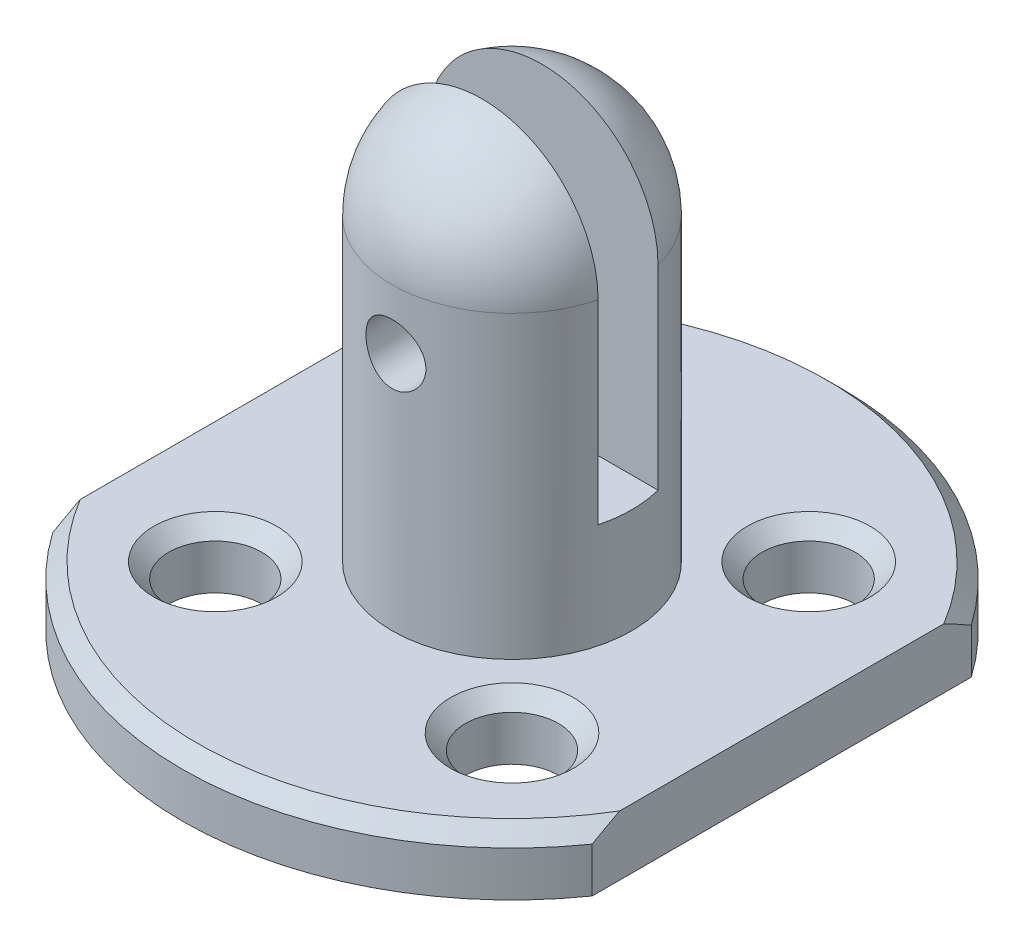
ISO-10303-21;
HEADER;
FILE_DESCRIPTION(('STEP AP214'),'2;1');
FILE_NAME('part.step','',(''),(''),'','','');
FILE_SCHEMA(('AUTOMOTIVE_DESIGN { 1 0 10303 214 1 1 1 1 }'));
ENDSEC;
DATA;
#1=APPLICATION_CONTEXT('core data for automotive mechanical design processes');
#2=APPLICATION_PROTOCOL_DEFINITION('international standard','automotive_design',2000,#1);
#3=PRODUCT_CONTEXT('',#1,'mechanical');
#4=PRODUCT('Part','Part','',(#3));
#5=PRODUCT_RELATED_PRODUCT_CATEGORY('part','',(#4));
#6=PRODUCT_DEFINITION_FORMATION('','',#4);
#7=PRODUCT_DEFINITION_CONTEXT('part definition',#1,'design');
#8=PRODUCT_DEFINITION('design','',#6,#7);
#9=PRODUCT_DEFINITION_SHAPE('','',#8);
#10=(LENGTH_UNIT() NAMED_UNIT(*) SI_UNIT(.MILLI.,.METRE.));
#11=(NAMED_UNIT(*) PLANE_ANGLE_UNIT() SI_UNIT($,.RADIAN.));
#12=(NAMED_UNIT(*) SI_UNIT($,.STERADIAN.) SOLID_ANGLE_UNIT());
#13=UNCERTAINTY_MEASURE_WITH_UNIT(LENGTH_MEASURE(1.E-05),#10,'distance_accuracy_value','');
#14=(GEOMETRIC_REPRESENTATION_CONTEXT(3) GLOBAL_UNCERTAINTY_ASSIGNED_CONTEXT((#13)) GLOBAL_UNIT_ASSIGNED_CONTEXT((#10,
#11,#12)) REPRESENTATION_CONTEXT('',''));
#15=CARTESIAN_POINT('',(0.,0.,0.));
#16=DIRECTION('',(0.,0.,1.));
#17=DIRECTION('',(1.,0.,0.));
#18=AXIS2_PLACEMENT_3D('',#15,#16,#17);
#19=CARTESIAN_POINT('',(0.,12.,0.));
#20=DIRECTION('',(0.,-1.,0.));
#21=DIRECTION('',(1.,0.,0.));
#22=AXIS2_PLACEMENT_3D('',#19,#20,#21);
#23=SPHERICAL_SURFACE('',#22,4.);
#24=CARTESIAN_POINT('',(0.,12.,-1.));
#25=DIRECTION('',(0.,0.,-1.));
#26=DIRECTION('',(-1.,0.,0.));
#27=AXIS2_PLACEMENT_3D('',#24,#25,#26);
#28=CIRCLE('',#27,3.87298334620742);
#29=CARTESIAN_POINT('',(3.87298334620742,12.,-1.));
#30=VERTEX_POINT('',#29);
#31=CARTESIAN_POINT('',(-3.87298334620742,12.,-1.));
#32=VERTEX_POINT('',#31);
#33=EDGE_CURVE('E209',#30,#32,#28,.F.);
#34=ORIENTED_EDGE('',*,*,#33,.F.);
#35=CARTESIAN_POINT('',(0.,12.,0.));
#36=DIRECTION('',(0.,-1.,0.));
#37=DIRECTION('',(0.,0.,-1.));
#38=AXIS2_PLACEMENT_3D('',#35,#36,#37);
#39=CIRCLE('',#38,4.);
#40=EDGE_CURVE('E211',#32,#30,#39,.T.);
#41=ORIENTED_EDGE('',*,*,#40,.F.);
#42=EDGE_LOOP('',(#34,#41));
#43=FACE_BOUND('',#42,.T.);
#44=ADVANCED_FACE('F35',(#43),#23,.T.);
#45=CARTESIAN_POINT('',(0.,2.,0.));
#46=DIRECTION('',(0.,-1.,0.));
#47=DIRECTION('',(0.,0.,-1.));
#48=AXIS2_PLACEMENT_3D('',#45,#46,#47);
#49=CYLINDRICAL_SURFACE('',#48,11.);
#50=DIRECTION('',(0.,-1.,0.));
#51=VECTOR('',#50,1.);
#52=CARTESIAN_POINT('',(9.,2.,6.32455532033676));
#53=LINE('',#52,#51);
#54=CARTESIAN_POINT('',(9.,1.5,6.32455532033676));
#55=VERTEX_POINT('',#54);
#56=CARTESIAN_POINT('',(9.,0.,6.32455532033676));
#57=VERTEX_POINT('',#56);
#58=EDGE_CURVE('E252',#55,#57,#53,.T.);
#59=ORIENTED_EDGE('',*,*,#58,.F.);
#60=CARTESIAN_POINT('',(0.,1.5,0.));
#61=DIRECTION('',(0.,1.,0.));
#62=DIRECTION('',(0.,0.,1.));
#63=AXIS2_PLACEMENT_3D('',#60,#61,#62);
#64=CIRCLE('',#63,11.);
#65=CARTESIAN_POINT('',(-9.,1.5,6.32455532033676));
#66=VERTEX_POINT('',#65);
#67=EDGE_CURVE('E360',#55,#66,#64,.F.);
#68=ORIENTED_EDGE('',*,*,#67,.T.);
#69=DIRECTION('',(0.,-1.,0.));
#70=VECTOR('',#69,1.);
#71=CARTESIAN_POINT('',(-9.,2.,6.32455532033676));
#72=LINE('',#71,#70);
#73=CARTESIAN_POINT('',(-9.,0.,6.32455532033676));
#74=VERTEX_POINT('',#73);
#75=EDGE_CURVE('E236',#66,#74,#72,.T.);
#76=ORIENTED_EDGE('',*,*,#75,.T.);
#77=CARTESIAN_POINT('',(0.,0.,0.));
#78=DIRECTION('',(0.,1.,0.));
#79=DIRECTION('',(0.,0.,1.));
#80=AXIS2_PLACEMENT_3D('',#77,#78,#79);
#81=CIRCLE('',#80,11.);
#82=EDGE_CURVE('E228',#74,#57,#81,.T.);
#83=ORIENTED_EDGE('',*,*,#82,.T.);
#84=EDGE_LOOP('',(#59,#68,#76,#83));
#85=FACE_BOUND('',#84,.T.);
#86=ADVANCED_FACE('F192',(#85),#49,.T.);
#87=CARTESIAN_POINT('',(9.,2.,6.32455532033676));
#88=DIRECTION('',(-1.,0.,0.));
#89=DIRECTION('',(0.,0.,1.));
#90=AXIS2_PLACEMENT_3D('',#87,#88,#89);
#91=PLANE('',#90);
#92=DIRECTION('',(0.,-1.,0.));
#93=VECTOR('',#92,1.);
#94=CARTESIAN_POINT('',(9.,2.,-6.32455532033676));
#95=LINE('',#94,#93);
#96=CARTESIAN_POINT('',(9.,1.5,-6.32455532033676));
#97=VERTEX_POINT('',#96);
#98=CARTESIAN_POINT('',(9.,0.,-6.32455532033676));
#99=VERTEX_POINT('',#98);
#100=EDGE_CURVE('E250',#97,#99,#95,.T.);
#101=ORIENTED_EDGE('',*,*,#100,.F.);
#102=CARTESIAN_POINT('',(9.,1.5,-6.32455532033676));
#103=CARTESIAN_POINT('',(9.,1.54336144120015,-6.24913787469335));
#104=CARTESIAN_POINT('',(9.,1.58633376454159,-6.17349604753121));
#105=CARTESIAN_POINT('',(9.,1.67144422351644,-6.02175786618529));
#106=CARTESIAN_POINT('',(9.,1.71358246931803,-5.94566157378086));
#107=CARTESIAN_POINT('',(9.,1.79698078713672,-5.79298790368604));
#108=CARTESIAN_POINT('',(9.,1.83824085057838,-5.71641052130725));
#109=CARTESIAN_POINT('',(9.,1.91983232897874,-5.56274968894725));
#110=CARTESIAN_POINT('',(9.,1.96016361969474,-5.48566617301227));
#111=CARTESIAN_POINT('',(9.,2.00000000000012,-5.40832691319605));
#112=B_SPLINE_CURVE_WITH_KNOTS('',3,(#102,#103,#104,#105,#106,#107,#108,#109,#110,#111),
.UNSPECIFIED.,.F.,.F.,(4,2,2,2,4),(0.,0.260982516626926,0.521930328496996,0.782880687352909,
1.04386575332713),.UNSPECIFIED.);
#113=CARTESIAN_POINT('',(9.,2.,-5.40832691319598));
#114=VERTEX_POINT('',#113);
#115=EDGE_CURVE('E309',#97,#114,#112,.T.);
#116=ORIENTED_EDGE('',*,*,#115,.T.);
#117=DIRECTION('',(0.,0.,-1.));
#118=VECTOR('',#117,1.);
#119=CARTESIAN_POINT('',(9.,2.,6.32455532033676));
#120=LINE('',#119,#118);
#121=CARTESIAN_POINT('',(9.,2.,5.40832691319599));
#122=VERTEX_POINT('',#121);
#123=EDGE_CURVE('E229',#122,#114,#120,.T.);
#124=ORIENTED_EDGE('',*,*,#123,.F.);
#125=CARTESIAN_POINT('',(9.,2.,5.40832691319599));
#126=CARTESIAN_POINT('',(9.,1.9601636196947,5.48566617301225));
#127=CARTESIAN_POINT('',(9.,1.91983232897873,5.56274968894724));
#128=CARTESIAN_POINT('',(9.,1.8382408505784,5.71641052130726));
#129=CARTESIAN_POINT('',(9.,1.79698078713673,5.79298790368605));
#130=CARTESIAN_POINT('',(9.,1.71358246931802,5.94566157378086));
#131=CARTESIAN_POINT('',(9.,1.67144422351644,6.02175786618528));
#132=CARTESIAN_POINT('',(9.,1.5863337645416,6.17349604753121));
#133=CARTESIAN_POINT('',(9.,1.54336144120018,6.24913787469336));
#134=CARTESIAN_POINT('',(9.,1.50000000000006,6.32455532033679));
#135=B_SPLINE_CURVE_WITH_KNOTS('',3,(#125,#126,#127,#128,#129,#130,#131,#132,#133,#134),
.UNSPECIFIED.,.F.,.F.,(4,2,2,2,4),(0.,0.260985065974223,0.521935424830137,0.782883236700204,
1.04386575332713),.UNSPECIFIED.);
#136=EDGE_CURVE('E60',#122,#55,#135,.T.);
#137=ORIENTED_EDGE('',*,*,#136,.T.);
#138=ORIENTED_EDGE('',*,*,#58,.T.);
#139=DIRECTION('',(0.,0.,-1.));
#140=VECTOR('',#139,1.);
#141=CARTESIAN_POINT('',(9.,0.,6.32455532033676));
#142=LINE('',#141,#140);
#143=EDGE_CURVE('E239',#57,#99,#142,.T.);
#144=ORIENTED_EDGE('',*,*,#143,.T.);
#145=EDGE_LOOP('',(#101,#116,#124,#137,#138,#144));
#146=FACE_BOUND('',#145,.T.);
#147=ADVANCED_FACE('F197',(#146),#91,.F.);
#148=CARTESIAN_POINT('',(0.,2.,0.));
#149=DIRECTION('',(0.,-1.,0.));
#150=DIRECTION('',(0.,0.,-1.));
#151=AXIS2_PLACEMENT_3D('',#148,#149,#150);
#152=CYLINDRICAL_SURFACE('',#151,11.);
#153=DIRECTION('',(0.,-1.,0.));
#154=VECTOR('',#153,1.);
#155=CARTESIAN_POINT('',(-9.,2.,-6.32455532033676));
#156=LINE('',#155,#154);
#157=CARTESIAN_POINT('',(-9.,1.5,-6.32455532033676));
#158=VERTEX_POINT('',#157);
#159=CARTESIAN_POINT('',(-9.,0.,-6.32455532033676));
#160=VERTEX_POINT('',#159);
#161=EDGE_CURVE('E248',#158,#160,#156,.T.);
#162=ORIENTED_EDGE('',*,*,#161,.F.);
#163=CARTESIAN_POINT('',(0.,1.5,0.));
#164=DIRECTION('',(0.,1.,0.));
#165=DIRECTION('',(0.,0.,1.));
#166=AXIS2_PLACEMENT_3D('',#163,#164,#165);
#167=CIRCLE('',#166,11.);
#168=EDGE_CURVE('E389',#158,#97,#167,.F.);
#169=ORIENTED_EDGE('',*,*,#168,.T.);
#170=ORIENTED_EDGE('',*,*,#100,.T.);
#171=CARTESIAN_POINT('',(0.,0.,0.));
#172=DIRECTION('',(0.,1.,0.));
#173=DIRECTION('',(0.,0.,1.));
#174=AXIS2_PLACEMENT_3D('',#171,#172,#173);
#175=CIRCLE('',#174,11.);
#176=EDGE_CURVE('E242',#99,#160,#175,.T.);
#177=ORIENTED_EDGE('',*,*,#176,.T.);
#178=EDGE_LOOP('',(#162,#169,#170,#177));
#179=FACE_BOUND('',#178,.T.);
#180=ADVANCED_FACE('F292',(#179),#152,.T.);
#181=CARTESIAN_POINT('',(-9.,2.,6.32455532033676));
#182=DIRECTION('',(1.,0.,0.));
#183=DIRECTION('',(0.,0.,-1.));
#184=AXIS2_PLACEMENT_3D('',#181,#182,#183);
#185=PLANE('',#184);
#186=DIRECTION('',(0.,0.,1.));
#187=VECTOR('',#186,1.);
#188=CARTESIAN_POINT('',(-9.,2.,6.32455532033676));
#189=LINE('',#188,#187);
#190=CARTESIAN_POINT('',(-9.,2.,-5.40832691319598));
#191=VERTEX_POINT('',#190);
#192=CARTESIAN_POINT('',(-9.,2.,5.40832691319599));
#193=VERTEX_POINT('',#192);
#194=EDGE_CURVE('E232',#191,#193,#189,.T.);
#195=ORIENTED_EDGE('',*,*,#194,.F.);
#196=CARTESIAN_POINT('',(-9.,2.,-5.40832691319598));
#197=CARTESIAN_POINT('',(-9.,1.9601636196947,-5.48566617301225));
#198=CARTESIAN_POINT('',(-9.,1.91983232897873,-5.56274968894724));
#199=CARTESIAN_POINT('',(-9.,1.8382408505784,-5.71641052130726));
#200=CARTESIAN_POINT('',(-9.,1.79698078713673,-5.79298790368604));
#201=CARTESIAN_POINT('',(-9.,1.71358246931802,-5.94566157378086));
#202=CARTESIAN_POINT('',(-9.,1.67144422351644,-6.02175786618528));
#203=CARTESIAN_POINT('',(-9.,1.5863337645416,-6.17349604753121));
#204=CARTESIAN_POINT('',(-9.,1.54336144120018,-6.24913787469336));
#205=CARTESIAN_POINT('',(-9.,1.50000000000006,-6.32455532033679));
#206=B_SPLINE_CURVE_WITH_KNOTS('',3,(#196,#197,#198,#199,#200,#201,#202,#203,#204,#205),
.UNSPECIFIED.,.F.,.F.,(4,2,2,2,4),(0.,0.260985065974223,0.521935424830139,0.782883236700208,
1.04386575332714),.UNSPECIFIED.);
#207=EDGE_CURVE('E279',#191,#158,#206,.T.);
#208=ORIENTED_EDGE('',*,*,#207,.T.);
#209=ORIENTED_EDGE('',*,*,#161,.T.);
#210=DIRECTION('',(0.,0.,1.));
#211=VECTOR('',#210,1.);
#212=CARTESIAN_POINT('',(-9.,0.,6.32455532033676));
#213=LINE('',#212,#211);
#214=EDGE_CURVE('E233',#160,#74,#213,.T.);
#215=ORIENTED_EDGE('',*,*,#214,.T.);
#216=ORIENTED_EDGE('',*,*,#75,.F.);
#217=CARTESIAN_POINT('',(-9.,1.5,6.32455532033676));
#218=CARTESIAN_POINT('',(-9.,1.54336144120015,6.24913787469335));
#219=CARTESIAN_POINT('',(-9.,1.58633376454159,6.17349604753121));
#220=CARTESIAN_POINT('',(-9.,1.67144422351644,6.02175786618529));
#221=CARTESIAN_POINT('',(-9.,1.71358246931803,5.94566157378086));
#222=CARTESIAN_POINT('',(-9.,1.79698078713672,5.79298790368604));
#223=CARTESIAN_POINT('',(-9.,1.83824085057838,5.71641052130726));
#224=CARTESIAN_POINT('',(-9.,1.91983232897874,5.56274968894725));
#225=CARTESIAN_POINT('',(-9.,1.96016361969474,5.48566617301228));
#226=CARTESIAN_POINT('',(-9.,2.00000000000012,5.40832691319605));
#227=B_SPLINE_CURVE_WITH_KNOTS('',3,(#217,#218,#219,#220,#221,#222,#223,#224,#225,#226),
.UNSPECIFIED.,.F.,.F.,(4,2,2,2,4),(0.,0.260982516626927,0.521930328496994,0.782880687352908,
1.04386575332713),.UNSPECIFIED.);
#228=EDGE_CURVE('E272',#66,#193,#227,.T.);
#229=ORIENTED_EDGE('',*,*,#228,.T.);
#230=EDGE_LOOP('',(#195,#208,#209,#215,#216,#229));
#231=FACE_BOUND('',#230,.T.);
#232=ADVANCED_FACE('F286',(#231),#185,.F.);
#233=CARTESIAN_POINT('',(0.,2.,0.));
#234=DIRECTION('',(0.,1.,0.));
#235=DIRECTION('',(0.,0.,1.));
#236=AXIS2_PLACEMENT_3D('',#233,#234,#235);
#237=PLANE('',#236);
#238=CARTESIAN_POINT('',(0.,2.,0.));
#239=DIRECTION('',(0.,1.,0.));
#240=DIRECTION('',(0.,0.,1.));
#241=AXIS2_PLACEMENT_3D('',#238,#239,#240);
#242=CIRCLE('',#241,4.);
#243=CARTESIAN_POINT('',(0.,2.,4.));
#244=VERTEX_POINT('',#243);
#245=EDGE_CURVE('E363',#244,#244,#242,.T.);
#246=ORIENTED_EDGE('',*,*,#245,.F.);
#247=EDGE_LOOP('',(#246));
#248=FACE_BOUND('',#247,.T.);
#249=CARTESIAN_POINT('',(-4.94974746830556,2.,4.9497474683061));
#250=DIRECTION('',(0.,1.,0.));
#251=DIRECTION('',(0.,0.,1.));
#252=AXIS2_PLACEMENT_3D('',#249,#250,#251);
#253=CIRCLE('',#252,2.05000000000021);
#254=CARTESIAN_POINT('',(-4.94974746830556,2.,6.99974746830631));
#255=VERTEX_POINT('',#254);
#256=EDGE_CURVE('E266',#255,#255,#253,.F.);
#257=ORIENTED_EDGE('',*,*,#256,.T.);
#258=EDGE_LOOP('',(#257));
#259=FACE_BOUND('',#258,.T.);
#260=CARTESIAN_POINT('',(-4.94974746830582,2.,-4.94974746830556));
#261=DIRECTION('',(0.,1.,0.));
#262=DIRECTION('',(0.,0.,1.));
#263=AXIS2_PLACEMENT_3D('',#260,#261,#262);
#264=CIRCLE('',#263,2.0500000000003);
#265=CARTESIAN_POINT('',(-4.94974746830582,2.,-2.89974746830526));
#266=VERTEX_POINT('',#265);
#267=EDGE_CURVE('E263',#266,#266,#264,.F.);
#268=ORIENTED_EDGE('',*,*,#267,.T.);
#269=EDGE_LOOP('',(#268));
#270=FACE_BOUND('',#269,.T.);
#271=CARTESIAN_POINT('',(4.94974746830584,2.,-4.94974746830582));
#272=DIRECTION('',(0.,1.,0.));
#273=DIRECTION('',(0.,0.,1.));
#274=AXIS2_PLACEMENT_3D('',#271,#272,#273);
#275=CIRCLE('',#274,2.05);
#276=CARTESIAN_POINT('',(4.94974746830584,2.,-2.89974746830582));
#277=VERTEX_POINT('',#276);
#278=EDGE_CURVE('E260',#277,#277,#275,.F.);
#279=ORIENTED_EDGE('',*,*,#278,.T.);
#280=EDGE_LOOP('',(#279));
#281=FACE_BOUND('',#280,.T.);
#282=CARTESIAN_POINT('',(4.9497474683061,2.,4.94974746830584));
#283=DIRECTION('',(0.,1.,0.));
#284=DIRECTION('',(0.,0.,1.));
#285=AXIS2_PLACEMENT_3D('',#282,#283,#284);
#286=CIRCLE('',#285,2.04999999999993);
#287=CARTESIAN_POINT('',(4.9497474683061,2.,6.99974746830577));
#288=VERTEX_POINT('',#287);
#289=EDGE_CURVE('E257',#288,#288,#286,.F.);
#290=ORIENTED_EDGE('',*,*,#289,.T.);
#291=EDGE_LOOP('',(#290));
#292=FACE_BOUND('',#291,.T.);
#293=ORIENTED_EDGE('',*,*,#123,.T.);
#294=CARTESIAN_POINT('',(0.,2.,0.));
#295=DIRECTION('',(0.,1.,0.));
#296=DIRECTION('',(0.,0.,1.));
#297=AXIS2_PLACEMENT_3D('',#294,#295,#296);
#298=CIRCLE('',#297,10.5);
#299=EDGE_CURVE('E269',#114,#191,#298,.T.);
#300=ORIENTED_EDGE('',*,*,#299,.T.);
#301=ORIENTED_EDGE('',*,*,#194,.T.);
#302=CARTESIAN_POINT('',(0.,2.,0.));
#303=DIRECTION('',(0.,1.,0.));
#304=DIRECTION('',(0.,0.,1.));
#305=AXIS2_PLACEMENT_3D('',#302,#303,#304);
#306=CIRCLE('',#305,10.5);
#307=EDGE_CURVE('E254',#193,#122,#306,.T.);
#308=ORIENTED_EDGE('',*,*,#307,.T.);
#309=EDGE_LOOP('',(#293,#300,#301,#308));
#310=FACE_BOUND('',#309,.T.);
#311=ADVANCED_FACE('F291',(#248,#259,#270,#281,#292,#310),#237,.T.);
#312=CARTESIAN_POINT('',(0.,0.,0.));
#313=DIRECTION('',(0.,1.,0.));
#314=DIRECTION('',(0.,0.,1.));
#315=AXIS2_PLACEMENT_3D('',#312,#313,#314);
#316=PLANE('',#315);
#317=CARTESIAN_POINT('',(0.,0.,0.));
#318=DIRECTION('',(0.,1.,0.));
#319=DIRECTION('',(0.,0.,1.));
#320=AXIS2_PLACEMENT_3D('',#317,#318,#319);
#321=CIRCLE('',#320,3.);
#322=CARTESIAN_POINT('',(0.,0.,3.));
#323=VERTEX_POINT('',#322);
#324=EDGE_CURVE('E11',#323,#323,#321,.F.);
#325=ORIENTED_EDGE('',*,*,#324,.F.);
#326=EDGE_LOOP('',(#325));
#327=FACE_BOUND('',#326,.T.);
#328=CARTESIAN_POINT('',(-4.94974746830582,0.,-4.94974746830556));
#329=DIRECTION('',(0.,1.,0.));
#330=DIRECTION('',(0.,0.,1.));
#331=AXIS2_PLACEMENT_3D('',#328,#329,#330);
#332=CIRCLE('',#331,1.5500000000003);
#333=CARTESIAN_POINT('',(-4.94974746830582,0.,-3.39974746830526));
#334=VERTEX_POINT('',#333);
#335=EDGE_CURVE('E223',#334,#334,#332,.T.);
#336=ORIENTED_EDGE('',*,*,#335,.T.);
#337=EDGE_LOOP('',(#336));
#338=FACE_BOUND('',#337,.T.);
#339=CARTESIAN_POINT('',(-4.94974746830556,0.,4.9497474683061));
#340=DIRECTION('',(0.,1.,0.));
#341=DIRECTION('',(0.,0.,1.));
#342=AXIS2_PLACEMENT_3D('',#339,#340,#341);
#343=CIRCLE('',#342,1.55000000000021);
#344=CARTESIAN_POINT('',(-4.94974746830556,0.,6.49974746830631));
#345=VERTEX_POINT('',#344);
#346=EDGE_CURVE('E220',#345,#345,#343,.T.);
#347=ORIENTED_EDGE('',*,*,#346,.T.);
#348=EDGE_LOOP('',(#347));
#349=FACE_BOUND('',#348,.T.);
#350=CARTESIAN_POINT('',(4.9497474683061,0.,4.94974746830584));
#351=DIRECTION('',(0.,1.,0.));
#352=DIRECTION('',(0.,0.,1.));
#353=AXIS2_PLACEMENT_3D('',#350,#351,#352);
#354=CIRCLE('',#353,1.54999999999993);
#355=CARTESIAN_POINT('',(4.9497474683061,0.,6.49974746830577));
#356=VERTEX_POINT('',#355);
#357=EDGE_CURVE('E216',#356,#356,#354,.T.);
#358=ORIENTED_EDGE('',*,*,#357,.T.);
#359=EDGE_LOOP('',(#358));
#360=FACE_BOUND('',#359,.T.);
#361=CARTESIAN_POINT('',(4.94974746830584,0.,-4.94974746830582));
#362=DIRECTION('',(0.,1.,0.));
#363=DIRECTION('',(0.,0.,1.));
#364=AXIS2_PLACEMENT_3D('',#361,#362,#363);
#365=CIRCLE('',#364,1.55);
#366=CARTESIAN_POINT('',(4.94974746830584,0.,-3.39974746830582));
#367=VERTEX_POINT('',#366);
#368=EDGE_CURVE('E219',#367,#367,#365,.T.);
#369=ORIENTED_EDGE('',*,*,#368,.T.);
#370=EDGE_LOOP('',(#369));
#371=FACE_BOUND('',#370,.T.);
#372=ORIENTED_EDGE('',*,*,#82,.F.);
#373=ORIENTED_EDGE('',*,*,#214,.F.);
#374=ORIENTED_EDGE('',*,*,#176,.F.);
#375=ORIENTED_EDGE('',*,*,#143,.F.);
#376=EDGE_LOOP('',(#372,#373,#374,#375));
#377=FACE_BOUND('',#376,.T.);
#378=ADVANCED_FACE('F294',(#327,#338,#349,#360,#371,#377),#316,.F.);
#379=CARTESIAN_POINT('',(4.94974746830584,0.,-4.94974746830582));
#380=DIRECTION('',(0.,1.,0.));
#381=DIRECTION('',(0.,0.,1.));
#382=AXIS2_PLACEMENT_3D('',#379,#380,#381);
#383=CYLINDRICAL_SURFACE('',#382,1.55);
#384=CARTESIAN_POINT('',(4.94974746830584,1.5,-4.94974746830582));
#385=DIRECTION('',(0.,1.,0.));
#386=DIRECTION('',(0.,0.,1.));
#387=AXIS2_PLACEMENT_3D('',#384,#385,#386);
#388=CIRCLE('',#387,1.55);
#389=CARTESIAN_POINT('',(4.94974746830584,1.5,-3.39974746830582));
#390=VERTEX_POINT('',#389);
#391=EDGE_CURVE('E361',#390,#390,#388,.T.);
#392=ORIENTED_EDGE('',*,*,#391,.T.);
#393=EDGE_LOOP('',(#392));
#394=FACE_BOUND('',#393,.T.);
#395=ORIENTED_EDGE('',*,*,#368,.F.);
#396=EDGE_LOOP('',(#395));
#397=FACE_BOUND('',#396,.T.);
#398=ADVANCED_FACE('F401',(#394,#397),#383,.F.);
#399=CARTESIAN_POINT('',(4.9497474683061,0.,4.94974746830584));
#400=DIRECTION('',(0.,1.,0.));
#401=DIRECTION('',(0.,0.,1.));
#402=AXIS2_PLACEMENT_3D('',#399,#400,#401);
#403=CYLINDRICAL_SURFACE('',#402,1.54999999999993);
#404=CARTESIAN_POINT('',(4.9497474683061,1.5,4.94974746830584));
#405=DIRECTION('',(0.,1.,0.));
#406=DIRECTION('',(0.,0.,1.));
#407=AXIS2_PLACEMENT_3D('',#404,#405,#406);
#408=CIRCLE('',#407,1.54999999999993);
#409=CARTESIAN_POINT('',(4.9497474683061,1.5,6.49974746830577));
#410=VERTEX_POINT('',#409);
#411=EDGE_CURVE('E358',#410,#410,#408,.T.);
#412=ORIENTED_EDGE('',*,*,#411,.T.);
#413=EDGE_LOOP('',(#412));
#414=FACE_BOUND('',#413,.T.);
#415=ORIENTED_EDGE('',*,*,#357,.F.);
#416=EDGE_LOOP('',(#415));
#417=FACE_BOUND('',#416,.T.);
#418=ADVANCED_FACE('F406',(#414,#417),#403,.F.);
#419=CARTESIAN_POINT('',(-4.94974746830556,0.,4.9497474683061));
#420=DIRECTION('',(0.,1.,0.));
#421=DIRECTION('',(0.,0.,1.));
#422=AXIS2_PLACEMENT_3D('',#419,#420,#421);
#423=CYLINDRICAL_SURFACE('',#422,1.55000000000021);
#424=CARTESIAN_POINT('',(-4.94974746830556,1.5,4.9497474683061));
#425=DIRECTION('',(0.,1.,0.));
#426=DIRECTION('',(0.,0.,1.));
#427=AXIS2_PLACEMENT_3D('',#424,#425,#426);
#428=CIRCLE('',#427,1.55000000000021);
#429=CARTESIAN_POINT('',(-4.94974746830556,1.5,6.49974746830631));
#430=VERTEX_POINT('',#429);
#431=EDGE_CURVE('E315',#430,#430,#428,.T.);
#432=ORIENTED_EDGE('',*,*,#431,.T.);
#433=EDGE_LOOP('',(#432));
#434=FACE_BOUND('',#433,.T.);
#435=ORIENTED_EDGE('',*,*,#346,.F.);
#436=EDGE_LOOP('',(#435));
#437=FACE_BOUND('',#436,.T.);
#438=ADVANCED_FACE('F421',(#434,#437),#423,.F.);
#439=CARTESIAN_POINT('',(-4.94974746830582,0.,-4.94974746830556));
#440=DIRECTION('',(0.,1.,0.));
#441=DIRECTION('',(0.,0.,1.));
#442=AXIS2_PLACEMENT_3D('',#439,#440,#441);
#443=CYLINDRICAL_SURFACE('',#442,1.5500000000003);
#444=CARTESIAN_POINT('',(-4.94974746830582,1.5,-4.94974746830556));
#445=DIRECTION('',(0.,1.,0.));
#446=DIRECTION('',(0.,0.,1.));
#447=AXIS2_PLACEMENT_3D('',#444,#445,#446);
#448=CIRCLE('',#447,1.5500000000003);
#449=CARTESIAN_POINT('',(-4.94974746830582,1.5,-3.39974746830526));
#450=VERTEX_POINT('',#449);
#451=EDGE_CURVE('E366',#450,#450,#448,.T.);
#452=ORIENTED_EDGE('',*,*,#451,.T.);
#453=EDGE_LOOP('',(#452));
#454=FACE_BOUND('',#453,.T.);
#455=ORIENTED_EDGE('',*,*,#335,.F.);
#456=EDGE_LOOP('',(#455));
#457=FACE_BOUND('',#456,.T.);
#458=ADVANCED_FACE('F326',(#454,#457),#443,.F.);
#459=CARTESIAN_POINT('',(0.,2.,0.));
#460=DIRECTION('',(0.,-1.,0.));
#461=DIRECTION('',(0.,0.,-1.));
#462=AXIS2_PLACEMENT_3D('',#459,#460,#461);
#463=CONICAL_SURFACE('',#462,10.5,0.785398163397448);
#464=ORIENTED_EDGE('',*,*,#115,.F.);
#465=ORIENTED_EDGE('',*,*,#168,.F.);
#466=ORIENTED_EDGE('',*,*,#207,.F.);
#467=ORIENTED_EDGE('',*,*,#299,.F.);
#468=EDGE_LOOP('',(#464,#465,#466,#467));
#469=FACE_BOUND('',#468,.T.);
#470=ADVANCED_FACE('F318',(#469),#463,.T.);
#471=CARTESIAN_POINT('',(-4.94974746830556,1.5,4.9497474683061));
#472=DIRECTION('',(0.,1.,0.));
#473=DIRECTION('',(0.,0.,1.));
#474=AXIS2_PLACEMENT_3D('',#471,#472,#473);
#475=CONICAL_SURFACE('',#474,1.55000000000021,0.78539816339745);
#476=ORIENTED_EDGE('',*,*,#256,.F.);
#477=EDGE_LOOP('',(#476));
#478=FACE_BOUND('',#477,.T.);
#479=ORIENTED_EDGE('',*,*,#431,.F.);
#480=EDGE_LOOP('',(#479));
#481=FACE_BOUND('',#480,.T.);
#482=ADVANCED_FACE('F325',(#478,#481),#475,.F.);
#483=CARTESIAN_POINT('',(-4.94974746830582,1.5,-4.94974746830556));
#484=DIRECTION('',(0.,1.,0.));
#485=DIRECTION('',(0.,0.,1.));
#486=AXIS2_PLACEMENT_3D('',#483,#484,#485);
#487=CONICAL_SURFACE('',#486,1.5500000000003,0.785398163397451);
#488=ORIENTED_EDGE('',*,*,#267,.F.);
#489=EDGE_LOOP('',(#488));
#490=FACE_BOUND('',#489,.T.);
#491=ORIENTED_EDGE('',*,*,#451,.F.);
#492=EDGE_LOOP('',(#491));
#493=FACE_BOUND('',#492,.T.);
#494=ADVANCED_FACE('F334',(#490,#493),#487,.F.);
#495=CARTESIAN_POINT('',(4.94974746830584,1.5,-4.94974746830582));
#496=DIRECTION('',(0.,1.,0.));
#497=DIRECTION('',(0.,0.,1.));
#498=AXIS2_PLACEMENT_3D('',#495,#496,#497);
#499=CONICAL_SURFACE('',#498,1.55,0.78539816339745);
#500=ORIENTED_EDGE('',*,*,#278,.F.);
#501=EDGE_LOOP('',(#500));
#502=FACE_BOUND('',#501,.T.);
#503=ORIENTED_EDGE('',*,*,#391,.F.);
#504=EDGE_LOOP('',(#503));
#505=FACE_BOUND('',#504,.T.);
#506=ADVANCED_FACE('F341',(#502,#505),#499,.F.);
#507=CARTESIAN_POINT('',(4.9497474683061,1.5,4.94974746830584));
#508=DIRECTION('',(0.,1.,0.));
#509=DIRECTION('',(0.,0.,1.));
#510=AXIS2_PLACEMENT_3D('',#507,#508,#509);
#511=CONICAL_SURFACE('',#510,1.54999999999993,0.78539816339745);
#512=ORIENTED_EDGE('',*,*,#289,.F.);
#513=EDGE_LOOP('',(#512));
#514=FACE_BOUND('',#513,.T.);
#515=ORIENTED_EDGE('',*,*,#411,.F.);
#516=EDGE_LOOP('',(#515));
#517=FACE_BOUND('',#516,.T.);
#518=ADVANCED_FACE('F207',(#514,#517),#511,.F.);
#519=CARTESIAN_POINT('',(0.,2.,0.));
#520=DIRECTION('',(0.,-1.,0.));
#521=DIRECTION('',(0.,0.,-1.));
#522=AXIS2_PLACEMENT_3D('',#519,#520,#521);
#523=CONICAL_SURFACE('',#522,10.5,0.785398163397448);
#524=ORIENTED_EDGE('',*,*,#228,.F.);
#525=ORIENTED_EDGE('',*,*,#67,.F.);
#526=ORIENTED_EDGE('',*,*,#136,.F.);
#527=ORIENTED_EDGE('',*,*,#307,.F.);
#528=EDGE_LOOP('',(#524,#525,#526,#527));
#529=FACE_BOUND('',#528,.T.);
#530=ADVANCED_FACE('F38',(#529),#523,.T.);
#531=CARTESIAN_POINT('',(0.,12.,1.));
#532=DIRECTION('',(0.,0.,1.));
#533=DIRECTION('',(1.,0.,0.));
#534=AXIS2_PLACEMENT_3D('',#531,#532,#533);
#535=CIRCLE('',#534,3.87298334620742);
#536=CARTESIAN_POINT('',(-3.87298334620742,12.,1.));
#537=VERTEX_POINT('',#536);
#538=CARTESIAN_POINT('',(3.87298334620742,12.,1.));
#539=VERTEX_POINT('',#538);
#540=EDGE_CURVE('E52',#537,#539,#535,.F.);
#541=ORIENTED_EDGE('',*,*,#540,.F.);
#542=EDGE_CURVE('E136',#539,#537,#39,.T.);
#543=ORIENTED_EDGE('',*,*,#542,.F.);
#544=EDGE_LOOP('',(#541,#543));
#545=FACE_BOUND('',#544,.T.);
#546=ADVANCED_FACE('F188',(#545),#23,.T.);
#547=CARTESIAN_POINT('',(0.,2.,0.));
#548=DIRECTION('',(0.,-1.,0.));
#549=DIRECTION('',(0.,0.,-1.));
#550=AXIS2_PLACEMENT_3D('',#547,#548,#549);
#551=CYLINDRICAL_SURFACE('',#550,4.);
#552=CARTESIAN_POINT('',(0.,11.,-4.));
#553=CARTESIAN_POINT('',(0.0552507257798208,10.9999984495079,-3.99999906578675));
#554=CARTESIAN_POINT('',(0.110518771887176,10.9954056328175,-3.99884385421219));
#555=CARTESIAN_POINT('',(0.219470882513689,10.977183232462,-3.99434742553261));
#556=CARTESIAN_POINT('',(0.27315403124716,10.9635485269748,-3.99100496946645));
#557=CARTESIAN_POINT('',(0.377347248121718,10.9277071643586,-3.98250417554693));
#558=CARTESIAN_POINT('',(0.427861042286669,10.9055108008565,-3.97734801894724));
#559=CARTESIAN_POINT('',(0.524448087936285,10.8532124066368,-3.96576895871729));
#560=CARTESIAN_POINT('',(0.57052118956584,10.823110109254,-3.95934601236034));
#561=CARTESIAN_POINT('',(0.657867951533947,10.7551994735639,-3.94578275727867));
#562=CARTESIAN_POINT('',(0.699037126707382,10.7172589500272,-3.93863138099022));
#563=CARTESIAN_POINT('',(0.774499284802203,10.6350318633941,-3.92449080078353));
#564=CARTESIAN_POINT('',(0.808791491299423,10.5907445847023,-3.91750161525565));
#565=CARTESIAN_POINT('',(0.870017695199355,10.4962698488417,-3.9043651713314));
#566=CARTESIAN_POINT('',(0.896834810616904,10.4460045127931,-3.89823196313737));
#567=CARTESIAN_POINT('',(0.941597939033685,10.3415010588944,-3.88766329874815));
#568=CARTESIAN_POINT('',(0.959545370292889,10.2872635777828,-3.88322757115192));
#569=CARTESIAN_POINT('',(0.985703224536194,10.1775043345317,-3.87666984478367));
#570=CARTESIAN_POINT('',(0.994101512222227,10.1220300693001,-3.87450327383617));
#571=CARTESIAN_POINT('',(1.00150785004524,10.0104209539907,-3.8725957502516));
#572=CARTESIAN_POINT('',(1.00051742787865,9.95428621286759,-3.87285440299096));
#573=CARTESIAN_POINT('',(0.98932434975952,9.84438946150368,-3.87572803664412));
#574=CARTESIAN_POINT('',(0.979345560127014,9.79060291902327,-3.87828575334586));
#575=CARTESIAN_POINT('',(0.950816124602071,9.6854926327258,-3.88537806450989));
#576=CARTESIAN_POINT('',(0.932264868046282,9.63416906464734,-3.88991279980464));
#577=CARTESIAN_POINT('',(0.886926318624769,9.53484132249862,-3.90050075936124));
#578=CARTESIAN_POINT('',(0.860057778155274,9.48687588547363,-3.90656884979614));
#579=CARTESIAN_POINT('',(0.798904184009969,9.39605419349544,-3.91953140564257));
#580=CARTESIAN_POINT('',(0.764617832539225,9.35319883462183,-3.9264260155649));
#581=CARTESIAN_POINT('',(0.688442283120811,9.2725309228704,-3.94050587026521));
#582=CARTESIAN_POINT('',(0.646364172110572,9.23489700662577,-3.94769379651981));
#583=CARTESIAN_POINT('',(0.556407945002466,9.1671858383574,-3.96137310385857));
#584=CARTESIAN_POINT('',(0.508529651805295,9.13710881715762,-3.96786446366277));
#585=CARTESIAN_POINT('',(0.408077259120927,9.08529960918374,-3.97945154729455));
#586=CARTESIAN_POINT('',(0.355487595472415,9.06359643983038,-3.9845424008515));
#587=CARTESIAN_POINT('',(0.247250672095254,9.02938846286028,-3.99271944660945));
#588=CARTESIAN_POINT('',(0.191603999433655,9.01688189572124,-3.99580602226187));
#589=CARTESIAN_POINT('',(0.0803599802600162,9.00169495629411,-3.9995699951425));
#590=CARTESIAN_POINT('',(0.0247978133254715,8.9987713159498,-4.00030702338852));
#591=CARTESIAN_POINT('',(-0.0860219165343403,9.00216600137032,-3.999458698763));
#592=CARTESIAN_POINT('',(-0.141279506429731,9.00848349519942,-3.99787355494564));
#593=CARTESIAN_POINT('',(-0.249076179184329,9.02998060559425,-3.99259720751571));
#594=CARTESIAN_POINT('',(-0.301643412645838,9.04502750898466,-3.98893756123874));
#595=CARTESIAN_POINT('',(-0.403504861635009,9.08340472268563,-3.97992471089423));
#596=CARTESIAN_POINT('',(-0.452798746021758,9.10673586954211,-3.97457133579928));
#597=CARTESIAN_POINT('',(-0.547682089619899,9.16149075258315,-3.96262205284207));
#598=CARTESIAN_POINT('',(-0.593190294557221,9.19305074159784,-3.95600578244621));
#599=CARTESIAN_POINT('',(-0.678351075762165,9.26319327253131,-3.94229672791613));
#600=CARTESIAN_POINT('',(-0.718002639315339,9.30177702641127,-3.93520386167803));
#601=CARTESIAN_POINT('',(-0.791327045381821,9.38600130722964,-3.92112637973847));
#602=CARTESIAN_POINT('',(-0.824829245081355,9.43179180200161,-3.91414869458187));
#603=CARTESIAN_POINT('',(-0.883673839341799,9.52848842297714,-3.90128585584826));
#604=CARTESIAN_POINT('',(-0.909016596105292,9.57939432197317,-3.89540065378017));
#605=CARTESIAN_POINT('',(-0.950634280406195,9.68460381494205,-3.88545396489777));
#606=CARTESIAN_POINT('',(-0.966962931102711,9.73888508556267,-3.88138170194604));
#607=CARTESIAN_POINT('',(-0.990230439969186,9.84953975859274,-3.87551162726789));
#608=CARTESIAN_POINT('',(-0.997171351652439,9.90591270068833,-3.87371331813291));
#609=CARTESIAN_POINT('',(-1.00135906022266,10.0174140159035,-3.87263267469304));
#610=CARTESIAN_POINT('',(-0.998878598520079,10.0725316234165,-3.87327955152176));
#611=CARTESIAN_POINT('',(-0.984918185541911,10.1815359257787,-3.87685272671895));
#612=CARTESIAN_POINT('',(-0.973438415124513,10.2354226453424,-3.87977897927904));
#613=CARTESIAN_POINT('',(-0.941954212961863,10.3401389727103,-3.88754173788482));
#614=CARTESIAN_POINT('',(-0.922000936453583,10.3909848701601,-3.89236676824206));
#615=CARTESIAN_POINT('',(-0.874176609070047,10.4886435884758,-3.90338503816552));
#616=CARTESIAN_POINT('',(-0.846304460022792,10.5354558487913,-3.90957846747182));
#617=CARTESIAN_POINT('',(-0.782578499091424,10.6250364193347,-3.92283756175675));
#618=CARTESIAN_POINT('',(-0.746535441941502,10.6676673822826,-3.92992176554505));
#619=CARTESIAN_POINT('',(-0.667859580793157,10.7463646965303,-3.94405351497524));
#620=CARTESIAN_POINT('',(-0.625225214174097,10.782429486742,-3.95110105151373));
#621=CARTESIAN_POINT('',(-0.533645057801726,10.8476075390431,-3.96451770431775));
#622=CARTESIAN_POINT('',(-0.484598948210923,10.8765830757811,-3.97087222243912));
#623=CARTESIAN_POINT('',(-0.382177373006982,10.9258316419604,-3.98203283316746));
#624=CARTESIAN_POINT('',(-0.328805042291158,10.946110907099,-3.98684003466521));
#625=CARTESIAN_POINT('',(-0.229606835495647,10.9743812202198,-3.99365373043694));
#626=CARTESIAN_POINT('',(-0.184253447272045,10.983967495369,-3.9960172336846));
#627=CARTESIAN_POINT('',(-0.0926040476908552,10.996777295748,-3.99919070154632));
#628=CARTESIAN_POINT('',(-0.0463081074950774,11.0000012995369,-4.00000078300596));
#629=CARTESIAN_POINT('',(0.,11.,-4.));
#630=B_SPLINE_CURVE_WITH_KNOTS('',3,(#552,#553,#554,#555,#556,#557,#558,#559,#560,#561,#562,
#563,#564,#565,#566,#567,#568,#569,#570,#571,#572,#573,#574,#575,#576,#577,#578,#579,#580,#581,
#582,#583,#584,#585,#586,#587,#588,#589,#590,#591,#592,#593,#594,#595,#596,#597,#598,#599,#600,
#601,#602,#603,#604,#605,#606,#607,#608,#609,#610,#611,#612,#613,#614,#615,#616,#617,#618,#619,
#620,#621,#622,#623,#624,#625,#626,#627,#628,#629),.UNSPECIFIED.,.T.,.F.,(4,2,2,2,2,2,2,2,2,2,2,
2,2,2,2,2,2,2,2,2,2,2,2,2,2,2,2,2,2,2,2,2,2,2,2,2,2,2,4),(0.,0.16558247498126,0.331258825175934,
0.496736601524071,0.662219960112886,0.83076290291426,0.999324863867079,1.17039098363871,
1.34142974112912,1.50904196732954,1.67662692075132,1.84014998004679,2.00368468977359,
2.16887018582586,2.33408460557442,2.50401000646013,2.67394059705498,2.84445486006076,
3.01493649125762,3.18105539299518,3.34715934075162,3.51080183009358,3.67446084881527,
3.84102391710235,4.0076157533868,4.17829672802984,4.34897012499672,4.51861503076025,
4.68822282168272,4.85295853599075,5.0176909397069,5.18144267039632,5.34521712091268,
5.51326384273274,5.68135046513612,5.85248123666392,6.02348909214234,6.16228161961433,
6.3010637069536),.UNSPECIFIED.);
#631=CARTESIAN_POINT('',(0.,11.,-4.));
#632=VERTEX_POINT('',#631);
#633=EDGE_CURVE('E130',#632,#632,#630,.T.);
#634=ORIENTED_EDGE('',*,*,#633,.F.);
#635=EDGE_LOOP('',(#634));
#636=FACE_BOUND('',#635,.T.);
#637=CARTESIAN_POINT('',(1.,10.,3.87298334620742));
#638=CARTESIAN_POINT('',(0.999998431438699,10.0552203003568,3.87298440057185));
#639=CARTESIAN_POINT('',(0.995410498208069,10.1104579594314,3.87417722499278));
#640=CARTESIAN_POINT('',(0.977209250194446,10.2193470312326,3.87880744892249));
#641=CARTESIAN_POINT('',(0.963590682698077,10.27299750178,3.8822461547418));
#642=CARTESIAN_POINT('',(0.927796479849635,10.3771214152878,3.89095489813012));
#643=CARTESIAN_POINT('',(0.905631891140944,10.4275988621578,3.8962225706936));
#644=CARTESIAN_POINT('',(0.853408456505407,10.5241243410125,3.90799276818327));
#645=CARTESIAN_POINT('',(0.823349275424505,10.5701721848311,3.91449534553241));
#646=CARTESIAN_POINT('',(0.755483370924517,10.6575446581058,3.92816286540368));
#647=CARTESIAN_POINT('',(0.717534755081557,10.6987574401403,3.93533839048709));
#648=CARTESIAN_POINT('',(0.635272825640328,10.7743045577439,3.94945150206622));
#649=CARTESIAN_POINT('',(0.590958917672139,10.8086382502486,3.95638906626691));
#650=CARTESIAN_POINT('',(0.496458080431564,10.8699101870526,3.96936166208095));
#651=CARTESIAN_POINT('',(0.446197830478043,10.8967385552646,3.975382749602));
#652=CARTESIAN_POINT('',(0.341705273717109,10.9415238576612,3.9857232477043));
#653=CARTESIAN_POINT('',(0.287473554316777,10.9594821007662,3.99004290933747));
#654=CARTESIAN_POINT('',(0.177743503501663,10.9856591338314,3.99641903539262));
#655=CARTESIAN_POINT('',(0.122293087819589,10.9940678577306,3.99851957537723));
#656=CARTESIAN_POINT('',(0.0107315277051073,11.0015033517102,4.00037437642922));
#657=CARTESIAN_POINT('',(-0.0453795178152281,11.0005315088838,4.00012898438682));
#658=CARTESIAN_POINT('',(-0.155352247172388,10.9893700598999,3.99735237981413));
#659=CARTESIAN_POINT('',(-0.209236215601068,10.9793854699785,3.99487200936349));
#660=CARTESIAN_POINT('',(-0.314538247413687,10.9508114919806,3.98796334609942));
#661=CARTESIAN_POINT('',(-0.365956179370439,10.932221645849,3.98353494959376));
#662=CARTESIAN_POINT('',(-0.465406703501807,10.8867989717252,3.97315003880358));
#663=CARTESIAN_POINT('',(-0.513404509766505,10.8598931821353,3.96718007878021));
#664=CARTESIAN_POINT('',(-0.604275622340489,10.7986577283535,3.9543596152386));
#665=CARTESIAN_POINT('',(-0.647148035085506,10.7643267725758,3.94750895860996));
#666=CARTESIAN_POINT('',(-0.727774035084957,10.6881165032071,3.93345485507808));
#667=CARTESIAN_POINT('',(-0.7653576790752,10.6460580430609,3.92624687810367));
#668=CARTESIAN_POINT('',(-0.832976375963019,10.5561600105839,3.91246017406682));
#669=CARTESIAN_POINT('',(-0.863011076046017,10.5083201682036,3.90588147642388));
#670=CARTESIAN_POINT('',(-0.914788129022598,10.4078839863404,3.89408198732659));
#671=CARTESIAN_POINT('',(-0.936489566970491,10.3552657078747,3.88886793490288));
#672=CARTESIAN_POINT('',(-0.970685620636341,10.2469658127694,3.88047456055983));
#673=CARTESIAN_POINT('',(-0.98318220655291,10.1912848544067,3.87729480324087));
#674=CARTESIAN_POINT('',(-0.998331855466071,10.0800161993908,3.87342142415656));
#675=CARTESIAN_POINT('',(-1.00123618956785,10.0244648826681,3.87266435637459));
#676=CARTESIAN_POINT('',(-0.997806796206219,9.91367122536874,3.87354937392416));
#677=CARTESIAN_POINT('',(-0.99147391913952,9.8584288568195,3.87519123840506));
#678=CARTESIAN_POINT('',(-0.969970185575065,9.75075429401812,3.88062832781824));
#679=CARTESIAN_POINT('',(-0.954945627312698,9.69829090937166,3.8843878809375));
#680=CARTESIAN_POINT('',(-0.916647232668248,9.59662741685933,3.89360287308385));
#681=CARTESIAN_POINT('',(-0.893372419085018,9.54742769637786,3.89905851299445));
#682=CARTESIAN_POINT('',(-0.838708267174623,9.45262348885306,3.91118454837305));
#683=CARTESIAN_POINT('',(-0.807168701534252,9.40710846398276,3.91787667442657));
#684=CARTESIAN_POINT('',(-0.737060292934456,9.32192465487946,3.93166833228686));
#685=CARTESIAN_POINT('',(-0.698490294805439,9.28225683333997,3.93876793091388));
#686=CARTESIAN_POINT('',(-0.614262720984725,9.20887558297161,3.95278961212642));
#687=CARTESIAN_POINT('',(-0.568451952531592,9.17533597498047,3.95970280824734));
#688=CARTESIAN_POINT('',(-0.471702682694675,9.1164256532195,3.97238886645493));
#689=CARTESIAN_POINT('',(-0.420764448957591,9.09105451335672,3.97816178801584));
#690=CARTESIAN_POINT('',(-0.31555820173109,9.04942158618883,3.98788046295325));
#691=CARTESIAN_POINT('',(-0.26131738102788,9.03309428624838,3.99183932008964));
#692=CARTESIAN_POINT('',(-0.150749760318807,9.00981586615663,3.99754117358315));
#693=CARTESIAN_POINT('',(-0.0944233650412425,9.00286293650438,3.99928459757363));
#694=CARTESIAN_POINT('',(0.0170835264433273,8.99863241042446,4.00034169408811));
#695=CARTESIAN_POINT('',(0.0722538269660339,9.00109829090461,3.99971978880008));
#696=CARTESIAN_POINT('',(0.18136749641474,9.01504782729433,3.99625896457423));
#697=CARTESIAN_POINT('',(0.235310901780887,9.0265312150131,3.99342011157094));
#698=CARTESIAN_POINT('',(0.340171035644817,9.05805221977093,3.98585432853963));
#699=CARTESIAN_POINT('',(0.391102494581021,9.07804345331462,3.98113764502668));
#700=CARTESIAN_POINT('',(0.48891705304147,9.12597057901933,3.97031288913382));
#701=CARTESIAN_POINT('',(0.535799641265052,9.15390747266957,3.96420464137727));
#702=CARTESIAN_POINT('',(0.625401928423901,9.21771523399707,3.95107249681342));
#703=CARTESIAN_POINT('',(0.667994988300588,9.25376014290737,3.94403016945646));
#704=CARTESIAN_POINT('',(0.746615020271252,9.33242285197381,3.92990649053207));
#705=CARTESIAN_POINT('',(0.782640325068179,9.37504231609794,3.92282512952424));
#706=CARTESIAN_POINT('',(0.847762026479241,9.46660141420129,3.90927475860682));
#707=CARTESIAN_POINT('',(0.876716619446595,9.51564412341248,3.90281963730391));
#708=CARTESIAN_POINT('',(0.925926896615623,9.61805548992285,3.8914395555011));
#709=CARTESIAN_POINT('',(0.946188909759557,9.67142096610729,3.88651348244814));
#710=CARTESIAN_POINT('',(0.974422528565572,9.77057701182628,3.87951908741315));
#711=CARTESIAN_POINT('',(0.983993170595829,9.81589316438236,3.87708663005761));
#712=CARTESIAN_POINT('',(0.99678229257282,9.90746886900147,3.87381838580358));
#713=CARTESIAN_POINT('',(1.00000131437052,9.95372834025063,3.87298246270639));
#714=CARTESIAN_POINT('',(1.,10.,3.87298334620742));
#715=B_SPLINE_CURVE_WITH_KNOTS('',3,(#637,#638,#639,#640,#641,#642,#643,#644,#645,#646,#647,
#648,#649,#650,#651,#652,#653,#654,#655,#656,#657,#658,#659,#660,#661,#662,#663,#664,#665,#666,
#667,#668,#669,#670,#671,#672,#673,#674,#675,#676,#677,#678,#679,#680,#681,#682,#683,#684,#685,
#686,#687,#688,#689,#690,#691,#692,#693,#694,#695,#696,#697,#698,#699,#700,#701,#702,#703,#704,
#705,#706,#707,#708,#709,#710,#711,#712,#713,#714),.UNSPECIFIED.,.T.,.F.,(4,2,2,2,2,2,2,2,2,2,2,
2,2,2,2,2,2,2,2,2,2,2,2,2,2,2,2,2,2,2,2,2,2,2,2,2,2,2,4),(0.,0.16549097667523,0.331078296534212,
0.496452290829153,0.661833306984659,0.830495816734649,0.999174085882212,1.17020598555443,
1.34121263935111,1.50875500394413,1.67627259462683,1.84007305071853,2.00388222686189,
2.16917149698052,2.3344895418384,2.50428186625039,2.67408212476195,2.84470572799635,
3.01529280048094,3.18137429900962,3.34744050869795,3.51078961999957,3.67415808564842,
3.84073138339938,4.00733207550293,4.17810132382402,4.34886166284096,4.51836829119046,
4.6878421955989,4.85273378447257,5.01762046947067,5.18161950620159,5.34563922291504,
5.51358838629103,5.68158012622478,5.85270590910146,6.02370688542922,6.16239130867207,
6.30106390036083),.UNSPECIFIED.);
#716=CARTESIAN_POINT('',(1.,10.,3.87298334620742));
#717=VERTEX_POINT('',#716);
#718=EDGE_CURVE('E148',#717,#717,#715,.T.);
#719=ORIENTED_EDGE('',*,*,#718,.F.);
#720=EDGE_LOOP('',(#719));
#721=FACE_BOUND('',#720,.T.);
#722=DIRECTION('',(0.,-1.,0.));
#723=VECTOR('',#722,1.);
#724=CARTESIAN_POINT('',(-3.87298334620742,2.,-1.));
#725=LINE('',#724,#723);
#726=CARTESIAN_POINT('',(-3.87298334620742,5.5,-1.));
#727=VERTEX_POINT('',#726);
#728=EDGE_CURVE('E45',#32,#727,#725,.T.);
#729=ORIENTED_EDGE('',*,*,#728,.F.);
#730=ORIENTED_EDGE('',*,*,#40,.T.);
#731=DIRECTION('',(0.,-1.,0.));
#732=VECTOR('',#731,1.);
#733=CARTESIAN_POINT('',(3.87298334620742,2.,-1.));
#734=LINE('',#733,#732);
#735=CARTESIAN_POINT('',(3.87298334620742,5.5,-1.));
#736=VERTEX_POINT('',#735);
#737=EDGE_CURVE('E137',#736,#30,#734,.F.);
#738=ORIENTED_EDGE('',*,*,#737,.F.);
#739=CARTESIAN_POINT('',(0.,5.5,0.));
#740=DIRECTION('',(0.,-1.,0.));
#741=DIRECTION('',(0.,0.,-1.));
#742=AXIS2_PLACEMENT_3D('',#739,#740,#741);
#743=CIRCLE('',#742,4.);
#744=CARTESIAN_POINT('',(3.87298334620742,5.5,1.));
#745=VERTEX_POINT('',#744);
#746=EDGE_CURVE('E127',#745,#736,#743,.F.);
#747=ORIENTED_EDGE('',*,*,#746,.F.);
#748=DIRECTION('',(0.,-1.,0.));
#749=VECTOR('',#748,1.);
#750=CARTESIAN_POINT('',(3.87298334620742,2.,1.));
#751=LINE('',#750,#749);
#752=EDGE_CURVE('E129',#539,#745,#751,.T.);
#753=ORIENTED_EDGE('',*,*,#752,.F.);
#754=ORIENTED_EDGE('',*,*,#542,.T.);
#755=DIRECTION('',(0.,-1.,0.));
#756=VECTOR('',#755,1.);
#757=CARTESIAN_POINT('',(-3.87298334620742,2.,1.));
#758=LINE('',#757,#756);
#759=CARTESIAN_POINT('',(-3.87298334620742,5.5,1.));
#760=VERTEX_POINT('',#759);
#761=EDGE_CURVE('E125',#760,#537,#758,.F.);
#762=ORIENTED_EDGE('',*,*,#761,.F.);
#763=EDGE_CURVE('E115',#727,#760,#743,.F.);
#764=ORIENTED_EDGE('',*,*,#763,.F.);
#765=EDGE_LOOP('',(#729,#730,#738,#747,#753,#754,#762,#764));
#766=FACE_BOUND('',#765,.T.);
#767=ORIENTED_EDGE('',*,*,#245,.T.);
#768=EDGE_LOOP('',(#767));
#769=FACE_BOUND('',#768,.T.);
#770=ADVANCED_FACE('F133',(#636,#721,#766,#769),#551,.T.);
#771=CARTESIAN_POINT('',(-9.,5.5,-1.));
#772=DIRECTION('',(0.,0.,-1.));
#773=DIRECTION('',(-1.,0.,0.));
#774=AXIS2_PLACEMENT_3D('',#771,#772,#773);
#775=PLANE('',#774);
#776=CARTESIAN_POINT('',(0.,10.,-1.));
#777=DIRECTION('',(0.,0.,-1.));
#778=DIRECTION('',(-1.,0.,0.));
#779=AXIS2_PLACEMENT_3D('',#776,#777,#778);
#780=CIRCLE('',#779,1.);
#781=CARTESIAN_POINT('',(-1.,10.,-1.));
#782=VERTEX_POINT('',#781);
#783=EDGE_CURVE('E143',#782,#782,#780,.T.);
#784=ORIENTED_EDGE('',*,*,#783,.T.);
#785=EDGE_LOOP('',(#784));
#786=FACE_BOUND('',#785,.T.);
#787=ORIENTED_EDGE('',*,*,#737,.T.);
#788=ORIENTED_EDGE('',*,*,#33,.T.);
#789=ORIENTED_EDGE('',*,*,#728,.T.);
#790=DIRECTION('',(1.,0.,0.));
#791=VECTOR('',#790,1.);
#792=CARTESIAN_POINT('',(-9.,5.5,-1.));
#793=LINE('',#792,#791);
#794=EDGE_CURVE('E121',#727,#736,#793,.T.);
#795=ORIENTED_EDGE('',*,*,#794,.T.);
#796=EDGE_LOOP('',(#787,#788,#789,#795));
#797=FACE_BOUND('',#796,.T.);
#798=ADVANCED_FACE('F181',(#786,#797),#775,.F.);
#799=CARTESIAN_POINT('',(-9.,5.5,1.));
#800=DIRECTION('',(0.,-1.,0.));
#801=DIRECTION('',(0.,0.,-1.));
#802=AXIS2_PLACEMENT_3D('',#799,#800,#801);
#803=PLANE('',#802);
#804=ORIENTED_EDGE('',*,*,#763,.T.);
#805=DIRECTION('',(1.,0.,0.));
#806=VECTOR('',#805,1.);
#807=CARTESIAN_POINT('',(-9.,5.5,1.));
#808=LINE('',#807,#806);
#809=EDGE_CURVE('E118',#760,#745,#808,.T.);
#810=ORIENTED_EDGE('',*,*,#809,.T.);
#811=ORIENTED_EDGE('',*,*,#746,.T.);
#812=ORIENTED_EDGE('',*,*,#794,.F.);
#813=EDGE_LOOP('',(#804,#810,#811,#812));
#814=FACE_BOUND('',#813,.T.);
#815=ADVANCED_FACE('F117',(#814),#803,.F.);
#816=CARTESIAN_POINT('',(-9.,5.5,1.));
#817=DIRECTION('',(0.,0.,1.));
#818=DIRECTION('',(1.,0.,0.));
#819=AXIS2_PLACEMENT_3D('',#816,#817,#818);
#820=PLANE('',#819);
#821=CARTESIAN_POINT('',(0.,10.,1.));
#822=DIRECTION('',(0.,0.,1.));
#823=DIRECTION('',(1.,0.,0.));
#824=AXIS2_PLACEMENT_3D('',#821,#822,#823);
#825=CIRCLE('',#824,1.);
#826=CARTESIAN_POINT('',(1.,10.,1.));
#827=VERTEX_POINT('',#826);
#828=EDGE_CURVE('E141',#827,#827,#825,.T.);
#829=ORIENTED_EDGE('',*,*,#828,.T.);
#830=EDGE_LOOP('',(#829));
#831=FACE_BOUND('',#830,.T.);
#832=ORIENTED_EDGE('',*,*,#761,.T.);
#833=ORIENTED_EDGE('',*,*,#540,.T.);
#834=ORIENTED_EDGE('',*,*,#752,.T.);
#835=ORIENTED_EDGE('',*,*,#809,.F.);
#836=EDGE_LOOP('',(#832,#833,#834,#835));
#837=FACE_BOUND('',#836,.T.);
#838=ADVANCED_FACE('F128',(#831,#837),#820,.F.);
#839=CARTESIAN_POINT('',(0.,10.,-11.));
#840=DIRECTION('',(0.,0.,1.));
#841=DIRECTION('',(1.,0.,0.));
#842=AXIS2_PLACEMENT_3D('',#839,#840,#841);
#843=CYLINDRICAL_SURFACE('',#842,1.);
#844=ORIENTED_EDGE('',*,*,#718,.T.);
#845=EDGE_LOOP('',(#844));
#846=FACE_BOUND('',#845,.T.);
#847=ORIENTED_EDGE('',*,*,#828,.F.);
#848=EDGE_LOOP('',(#847));
#849=FACE_BOUND('',#848,.T.);
#850=ADVANCED_FACE('F175',(#846,#849),#843,.F.);
#851=ORIENTED_EDGE('',*,*,#633,.T.);
#852=EDGE_LOOP('',(#851));
#853=FACE_BOUND('',#852,.T.);
#854=ORIENTED_EDGE('',*,*,#783,.F.);
#855=EDGE_LOOP('',(#854));
#856=FACE_BOUND('',#855,.T.);
#857=ADVANCED_FACE('F169',(#853,#856),#843,.F.);
#858=CARTESIAN_POINT('',(0.,-1.,0.));
#859=DIRECTION('',(0.,1.,0.));
#860=DIRECTION('',(0.,0.,1.));
#861=AXIS2_PLACEMENT_3D('',#858,#859,#860);
#862=CYLINDRICAL_SURFACE('',#861,3.);
#863=CARTESIAN_POINT('',(0.,-1.,0.));
#864=DIRECTION('',(0.,-1.,0.));
#865=DIRECTION('',(0.,0.,-1.));
#866=AXIS2_PLACEMENT_3D('',#863,#864,#865);
#867=CIRCLE('',#866,3.);
#868=CARTESIAN_POINT('',(0.,-1.,-3.));
#869=VERTEX_POINT('',#868);
#870=EDGE_CURVE('E144',#869,#869,#867,.T.);
#871=ORIENTED_EDGE('',*,*,#870,.F.);
#872=EDGE_LOOP('',(#871));
#873=FACE_BOUND('',#872,.T.);
#874=ORIENTED_EDGE('',*,*,#324,.T.);
#875=EDGE_LOOP('',(#874));
#876=FACE_BOUND('',#875,.T.);
#877=ADVANCED_FACE('F174',(#873,#876),#862,.T.);
#878=CARTESIAN_POINT('',(0.,-1.,0.));
#879=DIRECTION('',(0.,-1.,0.));
#880=DIRECTION('',(0.,0.,-1.));
#881=AXIS2_PLACEMENT_3D('',#878,#879,#880);
#882=PLANE('',#881);
#883=ORIENTED_EDGE('',*,*,#870,.T.);
#884=EDGE_LOOP('',(#883));
#885=FACE_BOUND('',#884,.T.);
#886=ADVANCED_FACE('F533',(#885),#882,.T.);
#887=CLOSED_SHELL('',(#44,#86,#147,#180,#232,#311,#378,#398,#418,#438,#458,#470,#482,#494,#506,
#518,#530,#546,#770,#798,#815,#838,#850,#857,#877,#886));
#888=MANIFOLD_SOLID_BREP('B2',#887);
#889=ADVANCED_BREP_SHAPE_REPRESENTATION('',(#18,#888),#14);
#890=SHAPE_DEFINITION_REPRESENTATION(#9,#889);
ENDSEC;
END-ISO-10303-21;
